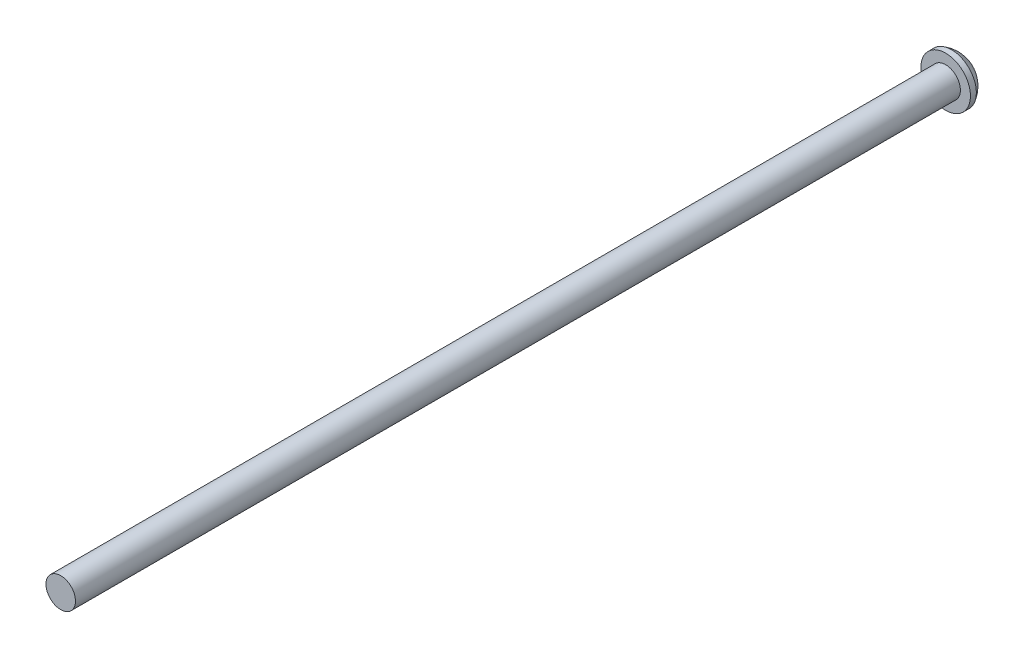
ISO-10303-21;
HEADER;
FILE_DESCRIPTION(('STEP AP214'),'2;1');
FILE_NAME('part.step','',(''),(''),'','','');
FILE_SCHEMA(('AUTOMOTIVE_DESIGN { 1 0 10303 214 1 1 1 1 }'));
ENDSEC;
DATA;
#1=APPLICATION_CONTEXT('core data for automotive mechanical design processes');
#2=APPLICATION_PROTOCOL_DEFINITION('international standard','automotive_design',2000,#1);
#3=PRODUCT_CONTEXT('',#1,'mechanical');
#4=PRODUCT('Part','Part','',(#3));
#5=PRODUCT_RELATED_PRODUCT_CATEGORY('part','',(#4));
#6=PRODUCT_DEFINITION_FORMATION('','',#4);
#7=PRODUCT_DEFINITION_CONTEXT('part definition',#1,'design');
#8=PRODUCT_DEFINITION('design','',#6,#7);
#9=PRODUCT_DEFINITION_SHAPE('','',#8);
#10=(LENGTH_UNIT() NAMED_UNIT(*) SI_UNIT(.MILLI.,.METRE.));
#11=(NAMED_UNIT(*) PLANE_ANGLE_UNIT() SI_UNIT($,.RADIAN.));
#12=(NAMED_UNIT(*) SI_UNIT($,.STERADIAN.) SOLID_ANGLE_UNIT());
#13=UNCERTAINTY_MEASURE_WITH_UNIT(LENGTH_MEASURE(1.E-05),#10,'distance_accuracy_value','');
#14=(GEOMETRIC_REPRESENTATION_CONTEXT(3) GLOBAL_UNCERTAINTY_ASSIGNED_CONTEXT((#13)) GLOBAL_UNIT_ASSIGNED_CONTEXT((#10,
#11,#12)) REPRESENTATION_CONTEXT('',''));
#15=CARTESIAN_POINT('',(0.,0.,0.));
#16=DIRECTION('',(0.,0.,1.));
#17=DIRECTION('',(1.,0.,0.));
#18=AXIS2_PLACEMENT_3D('',#15,#16,#17);
#19=CARTESIAN_POINT('',(0.,0.,59.7436720824305));
#20=DIRECTION('',(0.,0.,-1.));
#21=DIRECTION('',(-1.,0.,0.));
#22=AXIS2_PLACEMENT_3D('',#19,#20,#21);
#23=CYLINDRICAL_SURFACE('',#22,1.449675);
#24=CARTESIAN_POINT('',(0.,0.,59.7436720824305));
#25=DIRECTION('',(0.,0.,1.));
#26=DIRECTION('',(1.,0.,0.));
#27=AXIS2_PLACEMENT_3D('',#24,#25,#26);
#28=CIRCLE('',#27,1.449675);
#29=CARTESIAN_POINT('',(1.449675,0.,59.7436720824305));
#30=VERTEX_POINT('',#29);
#31=EDGE_CURVE('E10',#30,#30,#28,.T.);
#32=ORIENTED_EDGE('',*,*,#31,.F.);
#33=EDGE_LOOP('',(#32));
#34=FACE_BOUND('',#33,.T.);
#35=CARTESIAN_POINT('',(0.,0.,-27.2368279175696));
#36=DIRECTION('',(0.,0.,1.));
#37=DIRECTION('',(1.,0.,0.));
#38=AXIS2_PLACEMENT_3D('',#35,#36,#37);
#39=CIRCLE('',#38,1.449675);
#40=CARTESIAN_POINT('',(1.449675,0.,-27.2368279175696));
#41=VERTEX_POINT('',#40);
#42=EDGE_CURVE('E44',#41,#41,#39,.T.);
#43=ORIENTED_EDGE('',*,*,#42,.T.);
#44=EDGE_LOOP('',(#43));
#45=FACE_BOUND('',#44,.T.);
#46=ADVANCED_FACE('F36',(#34,#45),#23,.T.);
#47=CARTESIAN_POINT('',(0.,0.,59.7436720824305));
#48=DIRECTION('',(0.,0.,1.));
#49=DIRECTION('',(1.,0.,0.));
#50=AXIS2_PLACEMENT_3D('',#47,#48,#49);
#51=PLANE('',#50);
#52=ORIENTED_EDGE('',*,*,#31,.T.);
#53=EDGE_LOOP('',(#52));
#54=FACE_BOUND('',#53,.T.);
#55=ADVANCED_FACE('F60',(#54),#51,.T.);
#56=CARTESIAN_POINT('',(0.,0.,-27.8166979175696));
#57=DIRECTION('',(0.,0.,1.));
#58=DIRECTION('',(1.,0.,0.));
#59=AXIS2_PLACEMENT_3D('',#56,#57,#58);
#60=CYLINDRICAL_SURFACE('',#59,2.43787971004791);
#61=CARTESIAN_POINT('',(0.,0.,-27.8166979175696));
#62=DIRECTION('',(0.,0.,-1.));
#63=DIRECTION('',(-1.,0.,0.));
#64=AXIS2_PLACEMENT_3D('',#61,#62,#63);
#65=CIRCLE('',#64,2.43787971004791);
#66=CARTESIAN_POINT('',(-2.43787971004791,0.,-27.8166979175696));
#67=VERTEX_POINT('',#66);
#68=EDGE_CURVE('E40',#67,#67,#65,.T.);
#69=ORIENTED_EDGE('',*,*,#68,.F.);
#70=EDGE_LOOP('',(#69));
#71=FACE_BOUND('',#70,.T.);
#72=CARTESIAN_POINT('',(0.,0.,-27.2368279175696));
#73=DIRECTION('',(0.,0.,-1.));
#74=DIRECTION('',(-1.,0.,0.));
#75=AXIS2_PLACEMENT_3D('',#72,#73,#74);
#76=CIRCLE('',#75,2.43787971004791);
#77=CARTESIAN_POINT('',(-2.43787971004791,0.,-27.2368279175696));
#78=VERTEX_POINT('',#77);
#79=EDGE_CURVE('E50',#78,#78,#76,.T.);
#80=ORIENTED_EDGE('',*,*,#79,.T.);
#81=EDGE_LOOP('',(#80));
#82=FACE_BOUND('',#81,.T.);
#83=ADVANCED_FACE('F58',(#71,#82),#60,.T.);
#84=CARTESIAN_POINT('',(0.,0.,-26.4916768352448));
#85=DIRECTION('',(0.,0.,1.));
#86=DIRECTION('',(1.,0.,0.));
#87=AXIS2_PLACEMENT_3D('',#84,#85,#86);
#88=SPHERICAL_SURFACE('',#87,2.77469608232476);
#89=ORIENTED_EDGE('',*,*,#68,.T.);
#90=EDGE_LOOP('',(#89));
#91=FACE_BOUND('',#90,.T.);
#92=ADVANCED_FACE('F38',(#91),#88,.T.);
#93=CARTESIAN_POINT('',(0.,0.,-27.2368279175696));
#94=DIRECTION('',(0.,0.,-1.));
#95=DIRECTION('',(-1.,0.,0.));
#96=AXIS2_PLACEMENT_3D('',#93,#94,#95);
#97=PLANE('',#96);
#98=ORIENTED_EDGE('',*,*,#42,.F.);
#99=EDGE_LOOP('',(#98));
#100=FACE_BOUND('',#99,.T.);
#101=ORIENTED_EDGE('',*,*,#79,.F.);
#102=EDGE_LOOP('',(#101));
#103=FACE_BOUND('',#102,.T.);
#104=ADVANCED_FACE('F66',(#100,#103),#97,.F.);
#105=CLOSED_SHELL('',(#46,#55,#83,#92,#104));
#106=MANIFOLD_SOLID_BREP('B2',#105);
#107=ADVANCED_BREP_SHAPE_REPRESENTATION('',(#18,#106),#14);
#108=SHAPE_DEFINITION_REPRESENTATION(#9,#107);
ENDSEC;
END-ISO-10303-21;
